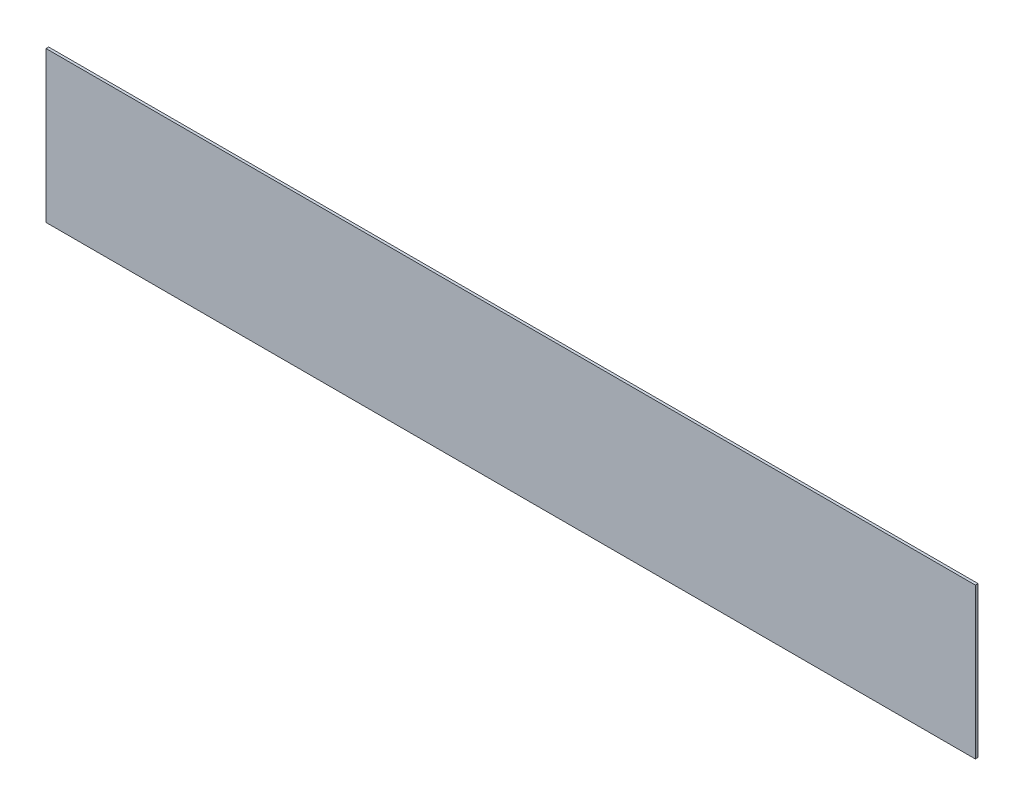
ISO-10303-21;
HEADER;
FILE_DESCRIPTION(('STEP AP214'),'2;1');
FILE_NAME('part.step','',(''),(''),'','','');
FILE_SCHEMA(('AUTOMOTIVE_DESIGN { 1 0 10303 214 1 1 1 1 }'));
ENDSEC;
DATA;
#1=APPLICATION_CONTEXT('core data for automotive mechanical design processes');
#2=APPLICATION_PROTOCOL_DEFINITION('international standard','automotive_design',2000,#1);
#3=PRODUCT_CONTEXT('',#1,'mechanical');
#4=PRODUCT('Part','Part','',(#3));
#5=PRODUCT_RELATED_PRODUCT_CATEGORY('part','',(#4));
#6=PRODUCT_DEFINITION_FORMATION('','',#4);
#7=PRODUCT_DEFINITION_CONTEXT('part definition',#1,'design');
#8=PRODUCT_DEFINITION('design','',#6,#7);
#9=PRODUCT_DEFINITION_SHAPE('','',#8);
#10=(LENGTH_UNIT() NAMED_UNIT(*) SI_UNIT(.MILLI.,.METRE.));
#11=(NAMED_UNIT(*) PLANE_ANGLE_UNIT() SI_UNIT($,.RADIAN.));
#12=(NAMED_UNIT(*) SI_UNIT($,.STERADIAN.) SOLID_ANGLE_UNIT());
#13=UNCERTAINTY_MEASURE_WITH_UNIT(LENGTH_MEASURE(1.E-05),#10,'distance_accuracy_value','');
#14=(GEOMETRIC_REPRESENTATION_CONTEXT(3) GLOBAL_UNCERTAINTY_ASSIGNED_CONTEXT((#13)) GLOBAL_UNIT_ASSIGNED_CONTEXT((#10,
#11,#12)) REPRESENTATION_CONTEXT('',''));
#15=CARTESIAN_POINT('',(0.,0.,0.));
#16=DIRECTION('',(0.,0.,1.));
#17=DIRECTION('',(1.,0.,0.));
#18=AXIS2_PLACEMENT_3D('',#15,#16,#17);
#19=CARTESIAN_POINT('',(0.,0.,1.27));
#20=DIRECTION('',(1.,0.,0.));
#21=DIRECTION('',(0.,0.,-1.));
#22=AXIS2_PLACEMENT_3D('',#19,#20,#21);
#23=PLANE('',#22);
#24=DIRECTION('',(0.,-1.,0.));
#25=VECTOR('',#24,1.);
#26=CARTESIAN_POINT('',(0.,0.,0.));
#27=LINE('',#26,#25);
#28=CARTESIAN_POINT('',(0.,72.46,0.));
#29=VERTEX_POINT('',#28);
#30=CARTESIAN_POINT('',(0.,0.,0.));
#31=VERTEX_POINT('',#30);
#32=EDGE_CURVE('E102',#29,#31,#27,.T.);
#33=ORIENTED_EDGE('',*,*,#32,.T.);
#34=DIRECTION('',(0.,0.,-1.));
#35=VECTOR('',#34,1.);
#36=CARTESIAN_POINT('',(0.,0.,1.27));
#37=LINE('',#36,#35);
#38=CARTESIAN_POINT('',(0.,0.,1.27));
#39=VERTEX_POINT('',#38);
#40=EDGE_CURVE('E11',#39,#31,#37,.T.);
#41=ORIENTED_EDGE('',*,*,#40,.F.);
#42=DIRECTION('',(0.,-1.,0.));
#43=VECTOR('',#42,1.);
#44=CARTESIAN_POINT('',(0.,0.,1.27));
#45=LINE('',#44,#43);
#46=CARTESIAN_POINT('',(0.,72.46,1.27));
#47=VERTEX_POINT('',#46);
#48=EDGE_CURVE('E90',#47,#39,#45,.T.);
#49=ORIENTED_EDGE('',*,*,#48,.F.);
#50=DIRECTION('',(0.,0.,-1.));
#51=VECTOR('',#50,1.);
#52=CARTESIAN_POINT('',(0.,72.46,1.27));
#53=LINE('',#52,#51);
#54=EDGE_CURVE('E98',#47,#29,#53,.T.);
#55=ORIENTED_EDGE('',*,*,#54,.T.);
#56=EDGE_LOOP('',(#33,#41,#49,#55));
#57=FACE_BOUND('',#56,.T.);
#58=ADVANCED_FACE('F39',(#57),#23,.F.);
#59=CARTESIAN_POINT('',(0.,0.,1.27));
#60=DIRECTION('',(0.,1.,0.));
#61=DIRECTION('',(0.,0.,1.));
#62=AXIS2_PLACEMENT_3D('',#59,#60,#61);
#63=PLANE('',#62);
#64=DIRECTION('',(1.,0.,0.));
#65=VECTOR('',#64,1.);
#66=CARTESIAN_POINT('',(0.,0.,0.));
#67=LINE('',#66,#65);
#68=CARTESIAN_POINT('',(447.,0.,0.));
#69=VERTEX_POINT('',#68);
#70=EDGE_CURVE('E94',#31,#69,#67,.T.);
#71=ORIENTED_EDGE('',*,*,#70,.T.);
#72=DIRECTION('',(0.,0.,-1.));
#73=VECTOR('',#72,1.);
#74=CARTESIAN_POINT('',(447.,0.,1.27));
#75=LINE('',#74,#73);
#76=CARTESIAN_POINT('',(447.,0.,1.27));
#77=VERTEX_POINT('',#76);
#78=EDGE_CURVE('E47',#77,#69,#75,.T.);
#79=ORIENTED_EDGE('',*,*,#78,.F.);
#80=DIRECTION('',(1.,0.,0.));
#81=VECTOR('',#80,1.);
#82=CARTESIAN_POINT('',(0.,0.,1.27));
#83=LINE('',#82,#81);
#84=EDGE_CURVE('E85',#39,#77,#83,.T.);
#85=ORIENTED_EDGE('',*,*,#84,.F.);
#86=ORIENTED_EDGE('',*,*,#40,.T.);
#87=EDGE_LOOP('',(#71,#79,#85,#86));
#88=FACE_BOUND('',#87,.T.);
#89=ADVANCED_FACE('F93',(#88),#63,.F.);
#90=CARTESIAN_POINT('',(447.,0.,1.27));
#91=DIRECTION('',(-1.,0.,0.));
#92=DIRECTION('',(0.,0.,1.));
#93=AXIS2_PLACEMENT_3D('',#90,#91,#92);
#94=PLANE('',#93);
#95=DIRECTION('',(0.,1.,0.));
#96=VECTOR('',#95,1.);
#97=CARTESIAN_POINT('',(447.,0.,0.));
#98=LINE('',#97,#96);
#99=CARTESIAN_POINT('',(447.,72.46,0.));
#100=VERTEX_POINT('',#99);
#101=EDGE_CURVE('E72',#69,#100,#98,.T.);
#102=ORIENTED_EDGE('',*,*,#101,.T.);
#103=DIRECTION('',(0.,0.,-1.));
#104=VECTOR('',#103,1.);
#105=CARTESIAN_POINT('',(447.,72.46,1.27));
#106=LINE('',#105,#104);
#107=CARTESIAN_POINT('',(447.,72.46,1.27));
#108=VERTEX_POINT('',#107);
#109=EDGE_CURVE('E95',#108,#100,#106,.T.);
#110=ORIENTED_EDGE('',*,*,#109,.F.);
#111=DIRECTION('',(0.,1.,0.));
#112=VECTOR('',#111,1.);
#113=CARTESIAN_POINT('',(447.,0.,1.27));
#114=LINE('',#113,#112);
#115=EDGE_CURVE('E88',#77,#108,#114,.T.);
#116=ORIENTED_EDGE('',*,*,#115,.F.);
#117=ORIENTED_EDGE('',*,*,#78,.T.);
#118=EDGE_LOOP('',(#102,#110,#116,#117));
#119=FACE_BOUND('',#118,.T.);
#120=ADVANCED_FACE('F96',(#119),#94,.F.);
#121=CARTESIAN_POINT('',(0.,72.46,1.27));
#122=DIRECTION('',(0.,-1.,0.));
#123=DIRECTION('',(0.,0.,-1.));
#124=AXIS2_PLACEMENT_3D('',#121,#122,#123);
#125=PLANE('',#124);
#126=DIRECTION('',(-1.,0.,0.));
#127=VECTOR('',#126,1.);
#128=CARTESIAN_POINT('',(0.,72.46,0.));
#129=LINE('',#128,#127);
#130=EDGE_CURVE('E78',#100,#29,#129,.T.);
#131=ORIENTED_EDGE('',*,*,#130,.T.);
#132=ORIENTED_EDGE('',*,*,#54,.F.);
#133=DIRECTION('',(-1.,0.,0.));
#134=VECTOR('',#133,1.);
#135=CARTESIAN_POINT('',(0.,72.46,1.27));
#136=LINE('',#135,#134);
#137=EDGE_CURVE('E55',#108,#47,#136,.T.);
#138=ORIENTED_EDGE('',*,*,#137,.F.);
#139=ORIENTED_EDGE('',*,*,#109,.T.);
#140=EDGE_LOOP('',(#131,#132,#138,#139));
#141=FACE_BOUND('',#140,.T.);
#142=ADVANCED_FACE('F109',(#141),#125,.F.);
#143=CARTESIAN_POINT('',(0.,0.,1.27));
#144=DIRECTION('',(0.,0.,-1.));
#145=DIRECTION('',(-1.,0.,0.));
#146=AXIS2_PLACEMENT_3D('',#143,#144,#145);
#147=PLANE('',#146);
#148=ORIENTED_EDGE('',*,*,#48,.T.);
#149=ORIENTED_EDGE('',*,*,#84,.T.);
#150=ORIENTED_EDGE('',*,*,#115,.T.);
#151=ORIENTED_EDGE('',*,*,#137,.T.);
#152=EDGE_LOOP('',(#148,#149,#150,#151));
#153=FACE_BOUND('',#152,.T.);
#154=ADVANCED_FACE('F86',(#153),#147,.F.);
#155=CARTESIAN_POINT('',(0.,0.,0.));
#156=DIRECTION('',(0.,0.,-1.));
#157=DIRECTION('',(-1.,0.,0.));
#158=AXIS2_PLACEMENT_3D('',#155,#156,#157);
#159=PLANE('',#158);
#160=ORIENTED_EDGE('',*,*,#32,.F.);
#161=ORIENTED_EDGE('',*,*,#130,.F.);
#162=ORIENTED_EDGE('',*,*,#101,.F.);
#163=ORIENTED_EDGE('',*,*,#70,.F.);
#164=EDGE_LOOP('',(#160,#161,#162,#163));
#165=FACE_BOUND('',#164,.T.);
#166=ADVANCED_FACE('F112',(#165),#159,.T.);
#167=CLOSED_SHELL('',(#58,#89,#120,#142,#154,#166));
#168=MANIFOLD_SOLID_BREP('B2',#167);
#169=ADVANCED_BREP_SHAPE_REPRESENTATION('',(#18,#168),#14);
#170=SHAPE_DEFINITION_REPRESENTATION(#9,#169);
ENDSEC;
END-ISO-10303-21;
